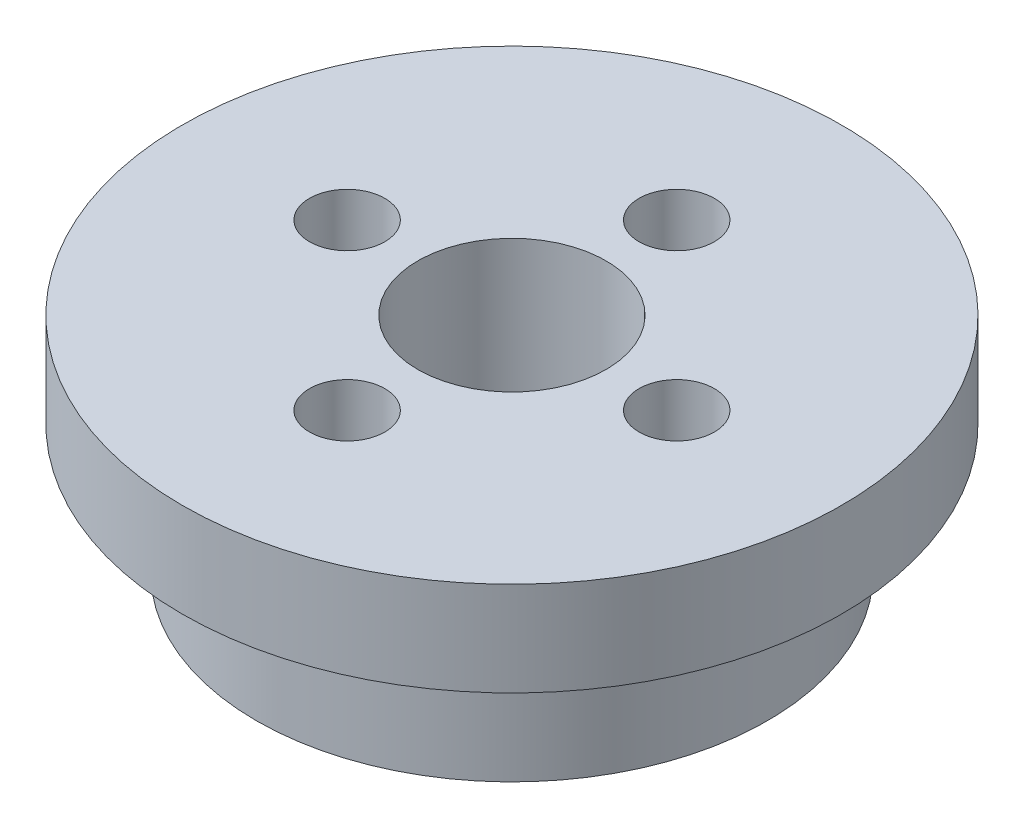
ISO-10303-21;
HEADER;
FILE_DESCRIPTION(('STEP AP214'),'2;1');
FILE_NAME('part.step','',(''),(''),'','','');
FILE_SCHEMA(('AUTOMOTIVE_DESIGN { 1 0 10303 214 1 1 1 1 }'));
ENDSEC;
DATA;
#1=APPLICATION_CONTEXT('core data for automotive mechanical design processes');
#2=APPLICATION_PROTOCOL_DEFINITION('international standard','automotive_design',2000,#1);
#3=PRODUCT_CONTEXT('',#1,'mechanical');
#4=PRODUCT('Part','Part','',(#3));
#5=PRODUCT_RELATED_PRODUCT_CATEGORY('part','',(#4));
#6=PRODUCT_DEFINITION_FORMATION('','',#4);
#7=PRODUCT_DEFINITION_CONTEXT('part definition',#1,'design');
#8=PRODUCT_DEFINITION('design','',#6,#7);
#9=PRODUCT_DEFINITION_SHAPE('','',#8);
#10=(LENGTH_UNIT() NAMED_UNIT(*) SI_UNIT(.MILLI.,.METRE.));
#11=(NAMED_UNIT(*) PLANE_ANGLE_UNIT() SI_UNIT($,.RADIAN.));
#12=(NAMED_UNIT(*) SI_UNIT($,.STERADIAN.) SOLID_ANGLE_UNIT());
#13=UNCERTAINTY_MEASURE_WITH_UNIT(LENGTH_MEASURE(1.E-05),#10,'distance_accuracy_value','');
#14=(GEOMETRIC_REPRESENTATION_CONTEXT(3) GLOBAL_UNCERTAINTY_ASSIGNED_CONTEXT((#13)) GLOBAL_UNIT_ASSIGNED_CONTEXT((#10,
#11,#12)) REPRESENTATION_CONTEXT('',''));
#15=CARTESIAN_POINT('',(0.,0.,0.));
#16=DIRECTION('',(0.,0.,1.));
#17=DIRECTION('',(1.,0.,0.));
#18=AXIS2_PLACEMENT_3D('',#15,#16,#17);
#19=CARTESIAN_POINT('',(0.,5.5,0.));
#20=DIRECTION('',(0.,-1.,0.));
#21=DIRECTION('',(0.,0.,-1.));
#22=AXIS2_PLACEMENT_3D('',#19,#20,#21);
#23=CYLINDRICAL_SURFACE('',#22,10.85);
#24=CARTESIAN_POINT('',(0.,5.5,0.));
#25=DIRECTION('',(0.,1.,0.));
#26=DIRECTION('',(0.,0.,1.));
#27=AXIS2_PLACEMENT_3D('',#24,#25,#26);
#28=CIRCLE('',#27,10.85);
#29=CARTESIAN_POINT('',(0.,5.5,10.85));
#30=VERTEX_POINT('',#29);
#31=EDGE_CURVE('E10',#30,#30,#28,.T.);
#32=ORIENTED_EDGE('',*,*,#31,.F.);
#33=EDGE_LOOP('',(#32));
#34=FACE_BOUND('',#33,.T.);
#35=CARTESIAN_POINT('',(0.,0.,0.));
#36=DIRECTION('',(0.,1.,0.));
#37=DIRECTION('',(0.,0.,1.));
#38=AXIS2_PLACEMENT_3D('',#35,#36,#37);
#39=CIRCLE('',#38,10.85);
#40=CARTESIAN_POINT('',(0.,0.,10.85));
#41=VERTEX_POINT('',#40);
#42=EDGE_CURVE('E36',#41,#41,#39,.T.);
#43=ORIENTED_EDGE('',*,*,#42,.T.);
#44=EDGE_LOOP('',(#43));
#45=FACE_BOUND('',#44,.T.);
#46=ADVANCED_FACE('F33',(#34,#45),#23,.T.);
#47=CARTESIAN_POINT('',(0.,0.,0.));
#48=DIRECTION('',(0.,1.,0.));
#49=DIRECTION('',(0.,0.,1.));
#50=AXIS2_PLACEMENT_3D('',#47,#48,#49);
#51=PLANE('',#50);
#52=CARTESIAN_POINT('',(-6.9999999999998,0.,1.99385646881822E-13));
#53=DIRECTION('',(0.,1.,0.));
#54=DIRECTION('',(0.,0.,1.));
#55=AXIS2_PLACEMENT_3D('',#52,#53,#54);
#56=CIRCLE('',#55,1.60000000000037);
#57=CARTESIAN_POINT('',(-6.9999999999998,0.,1.60000000000056));
#58=VERTEX_POINT('',#57);
#59=EDGE_CURVE('E56',#58,#58,#56,.T.);
#60=ORIENTED_EDGE('',*,*,#59,.T.);
#61=EDGE_LOOP('',(#60));
#62=FACE_BOUND('',#61,.T.);
#63=CARTESIAN_POINT('',(3.95765854616441E-13,0.,7.));
#64=DIRECTION('',(0.,1.,0.));
#65=DIRECTION('',(0.,0.,1.));
#66=AXIS2_PLACEMENT_3D('',#63,#64,#65);
#67=CIRCLE('',#66,1.60000000000047);
#68=CARTESIAN_POINT('',(3.95765854616441E-13,0.,8.60000000000047));
#69=VERTEX_POINT('',#68);
#70=EDGE_CURVE('E59',#69,#69,#67,.T.);
#71=ORIENTED_EDGE('',*,*,#70,.T.);
#72=EDGE_LOOP('',(#71));
#73=FACE_BOUND('',#72,.T.);
#74=CARTESIAN_POINT('',(7.0000000000002,0.,-1.98528394122419E-13));
#75=DIRECTION('',(0.,1.,0.));
#76=DIRECTION('',(0.,0.,1.));
#77=AXIS2_PLACEMENT_3D('',#74,#75,#76);
#78=CIRCLE('',#77,1.6000000000002);
#79=CARTESIAN_POINT('',(7.0000000000002,0.,1.6));
#80=VERTEX_POINT('',#79);
#81=EDGE_CURVE('E62',#80,#80,#78,.T.);
#82=ORIENTED_EDGE('',*,*,#81,.T.);
#83=EDGE_LOOP('',(#82));
#84=FACE_BOUND('',#83,.T.);
#85=CARTESIAN_POINT('',(0.,0.,-7.));
#86=DIRECTION('',(0.,1.,0.));
#87=DIRECTION('',(0.,0.,1.));
#88=AXIS2_PLACEMENT_3D('',#85,#86,#87);
#89=CIRCLE('',#88,1.6);
#90=CARTESIAN_POINT('',(0.,0.,-5.4));
#91=VERTEX_POINT('',#90);
#92=EDGE_CURVE('E65',#91,#91,#89,.T.);
#93=ORIENTED_EDGE('',*,*,#92,.T.);
#94=EDGE_LOOP('',(#93));
#95=FACE_BOUND('',#94,.T.);
#96=CARTESIAN_POINT('',(0.,0.,0.));
#97=DIRECTION('',(0.,1.,0.));
#98=DIRECTION('',(0.,0.,1.));
#99=AXIS2_PLACEMENT_3D('',#96,#97,#98);
#100=CIRCLE('',#99,4.);
#101=CARTESIAN_POINT('',(0.,0.,4.));
#102=VERTEX_POINT('',#101);
#103=EDGE_CURVE('E48',#102,#102,#100,.T.);
#104=ORIENTED_EDGE('',*,*,#103,.T.);
#105=EDGE_LOOP('',(#104));
#106=FACE_BOUND('',#105,.T.);
#107=ORIENTED_EDGE('',*,*,#42,.F.);
#108=EDGE_LOOP('',(#107));
#109=FACE_BOUND('',#108,.T.);
#110=ADVANCED_FACE('F101',(#62,#73,#84,#95,#106,#109),#51,.F.);
#111=CARTESIAN_POINT('',(0.,9.5,0.));
#112=DIRECTION('',(0.,-1.,0.));
#113=DIRECTION('',(0.,0.,-1.));
#114=AXIS2_PLACEMENT_3D('',#111,#112,#113);
#115=CYLINDRICAL_SURFACE('',#114,14.);
#116=CARTESIAN_POINT('',(0.,9.5,0.));
#117=DIRECTION('',(0.,1.,0.));
#118=DIRECTION('',(0.,0.,1.));
#119=AXIS2_PLACEMENT_3D('',#116,#117,#118);
#120=CIRCLE('',#119,14.);
#121=CARTESIAN_POINT('',(0.,9.5,14.));
#122=VERTEX_POINT('',#121);
#123=EDGE_CURVE('E43',#122,#122,#120,.T.);
#124=ORIENTED_EDGE('',*,*,#123,.F.);
#125=EDGE_LOOP('',(#124));
#126=FACE_BOUND('',#125,.T.);
#127=CARTESIAN_POINT('',(0.,5.5,0.));
#128=DIRECTION('',(0.,1.,0.));
#129=DIRECTION('',(0.,0.,1.));
#130=AXIS2_PLACEMENT_3D('',#127,#128,#129);
#131=CIRCLE('',#130,14.);
#132=CARTESIAN_POINT('',(0.,5.5,14.));
#133=VERTEX_POINT('',#132);
#134=EDGE_CURVE('E45',#133,#133,#131,.T.);
#135=ORIENTED_EDGE('',*,*,#134,.T.);
#136=EDGE_LOOP('',(#135));
#137=FACE_BOUND('',#136,.T.);
#138=ADVANCED_FACE('F88',(#126,#137),#115,.T.);
#139=CARTESIAN_POINT('',(0.,9.5,0.));
#140=DIRECTION('',(0.,1.,0.));
#141=DIRECTION('',(0.,0.,1.));
#142=AXIS2_PLACEMENT_3D('',#139,#140,#141);
#143=PLANE('',#142);
#144=CARTESIAN_POINT('',(-6.9999999999998,9.5,1.99385646881822E-13));
#145=DIRECTION('',(0.,1.,0.));
#146=DIRECTION('',(0.,0.,1.));
#147=AXIS2_PLACEMENT_3D('',#144,#145,#146);
#148=CIRCLE('',#147,1.60000000000037);
#149=CARTESIAN_POINT('',(-6.9999999999998,9.5,1.60000000000056));
#150=VERTEX_POINT('',#149);
#151=EDGE_CURVE('E75',#150,#150,#148,.T.);
#152=ORIENTED_EDGE('',*,*,#151,.F.);
#153=EDGE_LOOP('',(#152));
#154=FACE_BOUND('',#153,.T.);
#155=CARTESIAN_POINT('',(3.95765854616441E-13,9.5,7.));
#156=DIRECTION('',(0.,1.,0.));
#157=DIRECTION('',(0.,0.,1.));
#158=AXIS2_PLACEMENT_3D('',#155,#156,#157);
#159=CIRCLE('',#158,1.60000000000047);
#160=CARTESIAN_POINT('',(3.95765854616441E-13,9.5,8.60000000000047));
#161=VERTEX_POINT('',#160);
#162=EDGE_CURVE('E72',#161,#161,#159,.T.);
#163=ORIENTED_EDGE('',*,*,#162,.F.);
#164=EDGE_LOOP('',(#163));
#165=FACE_BOUND('',#164,.T.);
#166=CARTESIAN_POINT('',(7.0000000000002,9.5,-1.98528394122419E-13));
#167=DIRECTION('',(0.,1.,0.));
#168=DIRECTION('',(0.,0.,1.));
#169=AXIS2_PLACEMENT_3D('',#166,#167,#168);
#170=CIRCLE('',#169,1.6000000000002);
#171=CARTESIAN_POINT('',(7.0000000000002,9.5,1.6));
#172=VERTEX_POINT('',#171);
#173=EDGE_CURVE('E69',#172,#172,#170,.T.);
#174=ORIENTED_EDGE('',*,*,#173,.F.);
#175=EDGE_LOOP('',(#174));
#176=FACE_BOUND('',#175,.T.);
#177=CARTESIAN_POINT('',(0.,9.5,-7.));
#178=DIRECTION('',(0.,1.,0.));
#179=DIRECTION('',(0.,0.,1.));
#180=AXIS2_PLACEMENT_3D('',#177,#178,#179);
#181=CIRCLE('',#180,1.6);
#182=CARTESIAN_POINT('',(0.,9.5,-5.4));
#183=VERTEX_POINT('',#182);
#184=EDGE_CURVE('E68',#183,#183,#181,.T.);
#185=ORIENTED_EDGE('',*,*,#184,.F.);
#186=EDGE_LOOP('',(#185));
#187=FACE_BOUND('',#186,.T.);
#188=CARTESIAN_POINT('',(0.,9.5,0.));
#189=DIRECTION('',(0.,1.,0.));
#190=DIRECTION('',(0.,0.,1.));
#191=AXIS2_PLACEMENT_3D('',#188,#189,#190);
#192=CIRCLE('',#191,4.);
#193=CARTESIAN_POINT('',(0.,9.5,4.));
#194=VERTEX_POINT('',#193);
#195=EDGE_CURVE('E53',#194,#194,#192,.T.);
#196=ORIENTED_EDGE('',*,*,#195,.F.);
#197=EDGE_LOOP('',(#196));
#198=FACE_BOUND('',#197,.T.);
#199=ORIENTED_EDGE('',*,*,#123,.T.);
#200=EDGE_LOOP('',(#199));
#201=FACE_BOUND('',#200,.T.);
#202=ADVANCED_FACE('F84',(#154,#165,#176,#187,#198,#201),#143,.T.);
#203=CARTESIAN_POINT('',(0.,5.5,0.));
#204=DIRECTION('',(0.,1.,0.));
#205=DIRECTION('',(0.,0.,1.));
#206=AXIS2_PLACEMENT_3D('',#203,#204,#205);
#207=PLANE('',#206);
#208=ORIENTED_EDGE('',*,*,#31,.T.);
#209=EDGE_LOOP('',(#208));
#210=FACE_BOUND('',#209,.T.);
#211=ORIENTED_EDGE('',*,*,#134,.F.);
#212=EDGE_LOOP('',(#211));
#213=FACE_BOUND('',#212,.T.);
#214=ADVANCED_FACE('F87',(#210,#213),#207,.F.);
#215=CARTESIAN_POINT('',(0.,-40.5,0.));
#216=DIRECTION('',(0.,1.,0.));
#217=DIRECTION('',(0.,0.,1.));
#218=AXIS2_PLACEMENT_3D('',#215,#216,#217);
#219=CYLINDRICAL_SURFACE('',#218,4.);
#220=ORIENTED_EDGE('',*,*,#195,.T.);
#221=EDGE_LOOP('',(#220));
#222=FACE_BOUND('',#221,.T.);
#223=ORIENTED_EDGE('',*,*,#103,.F.);
#224=EDGE_LOOP('',(#223));
#225=FACE_BOUND('',#224,.T.);
#226=ADVANCED_FACE('F106',(#222,#225),#219,.F.);
#227=CARTESIAN_POINT('',(0.,-40.5,-7.));
#228=DIRECTION('',(0.,1.,0.));
#229=DIRECTION('',(0.,0.,1.));
#230=AXIS2_PLACEMENT_3D('',#227,#228,#229);
#231=CYLINDRICAL_SURFACE('',#230,1.6);
#232=ORIENTED_EDGE('',*,*,#184,.T.);
#233=EDGE_LOOP('',(#232));
#234=FACE_BOUND('',#233,.T.);
#235=ORIENTED_EDGE('',*,*,#92,.F.);
#236=EDGE_LOOP('',(#235));
#237=FACE_BOUND('',#236,.T.);
#238=ADVANCED_FACE('F111',(#234,#237),#231,.F.);
#239=CARTESIAN_POINT('',(7.0000000000002,-40.5,-1.98528394122419E-13));
#240=DIRECTION('',(0.,1.,0.));
#241=DIRECTION('',(0.,0.,1.));
#242=AXIS2_PLACEMENT_3D('',#239,#240,#241);
#243=CYLINDRICAL_SURFACE('',#242,1.6000000000002);
#244=ORIENTED_EDGE('',*,*,#173,.T.);
#245=EDGE_LOOP('',(#244));
#246=FACE_BOUND('',#245,.T.);
#247=ORIENTED_EDGE('',*,*,#81,.F.);
#248=EDGE_LOOP('',(#247));
#249=FACE_BOUND('',#248,.T.);
#250=ADVANCED_FACE('F137',(#246,#249),#243,.F.);
#251=CARTESIAN_POINT('',(3.95765854616441E-13,-40.5,7.));
#252=DIRECTION('',(0.,1.,0.));
#253=DIRECTION('',(0.,0.,1.));
#254=AXIS2_PLACEMENT_3D('',#251,#252,#253);
#255=CYLINDRICAL_SURFACE('',#254,1.60000000000047);
#256=ORIENTED_EDGE('',*,*,#162,.T.);
#257=EDGE_LOOP('',(#256));
#258=FACE_BOUND('',#257,.T.);
#259=ORIENTED_EDGE('',*,*,#70,.F.);
#260=EDGE_LOOP('',(#259));
#261=FACE_BOUND('',#260,.T.);
#262=ADVANCED_FACE('F81',(#258,#261),#255,.F.);
#263=CARTESIAN_POINT('',(-6.9999999999998,-40.5,1.99385646881822E-13));
#264=DIRECTION('',(0.,1.,0.));
#265=DIRECTION('',(0.,0.,1.));
#266=AXIS2_PLACEMENT_3D('',#263,#264,#265);
#267=CYLINDRICAL_SURFACE('',#266,1.60000000000037);
#268=ORIENTED_EDGE('',*,*,#151,.T.);
#269=EDGE_LOOP('',(#268));
#270=FACE_BOUND('',#269,.T.);
#271=ORIENTED_EDGE('',*,*,#59,.F.);
#272=EDGE_LOOP('',(#271));
#273=FACE_BOUND('',#272,.T.);
#274=ADVANCED_FACE('F146',(#270,#273),#267,.F.);
#275=CLOSED_SHELL('',(#46,#110,#138,#202,#214,#226,#238,#250,#262,#274));
#276=MANIFOLD_SOLID_BREP('B2',#275);
#277=ADVANCED_BREP_SHAPE_REPRESENTATION('',(#18,#276),#14);
#278=SHAPE_DEFINITION_REPRESENTATION(#9,#277);
ENDSEC;
END-ISO-10303-21;
